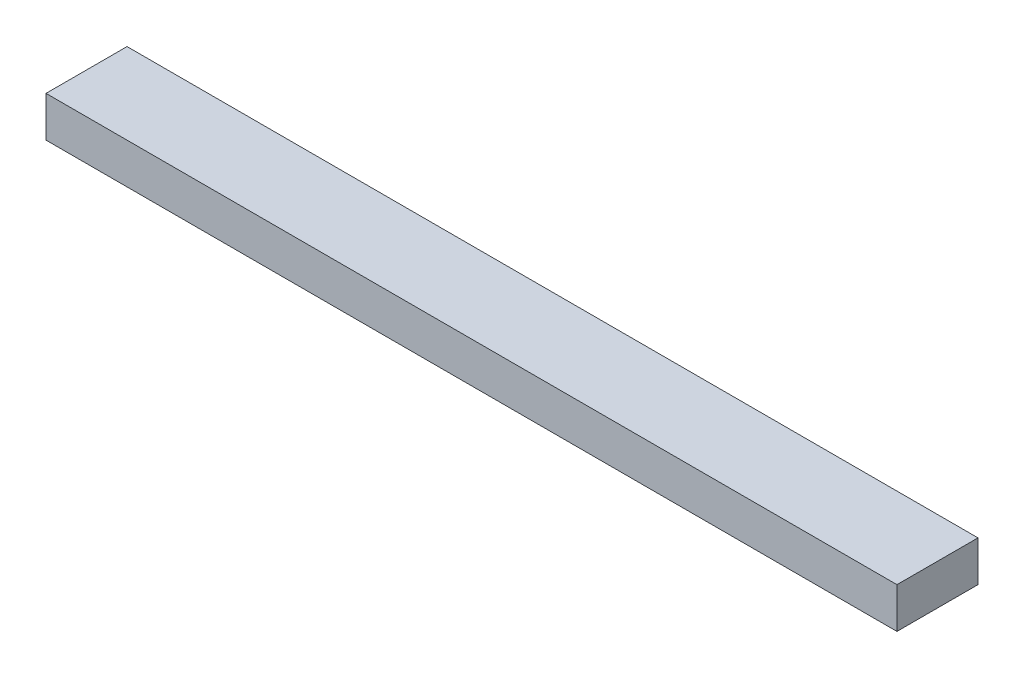
ISO-10303-21;
HEADER;
FILE_DESCRIPTION(('STEP AP214'),'2;1');
FILE_NAME('part.step','',(''),(''),'','','');
FILE_SCHEMA(('AUTOMOTIVE_DESIGN { 1 0 10303 214 1 1 1 1 }'));
ENDSEC;
DATA;
#1=APPLICATION_CONTEXT('core data for automotive mechanical design processes');
#2=APPLICATION_PROTOCOL_DEFINITION('international standard','automotive_design',2000,#1);
#3=PRODUCT_CONTEXT('',#1,'mechanical');
#4=PRODUCT('Part','Part','',(#3));
#5=PRODUCT_RELATED_PRODUCT_CATEGORY('part','',(#4));
#6=PRODUCT_DEFINITION_FORMATION('','',#4);
#7=PRODUCT_DEFINITION_CONTEXT('part definition',#1,'design');
#8=PRODUCT_DEFINITION('design','',#6,#7);
#9=PRODUCT_DEFINITION_SHAPE('','',#8);
#10=(LENGTH_UNIT() NAMED_UNIT(*) SI_UNIT(.MILLI.,.METRE.));
#11=(NAMED_UNIT(*) PLANE_ANGLE_UNIT() SI_UNIT($,.RADIAN.));
#12=(NAMED_UNIT(*) SI_UNIT($,.STERADIAN.) SOLID_ANGLE_UNIT());
#13=UNCERTAINTY_MEASURE_WITH_UNIT(LENGTH_MEASURE(1.E-05),#10,'distance_accuracy_value','');
#14=(GEOMETRIC_REPRESENTATION_CONTEXT(3) GLOBAL_UNCERTAINTY_ASSIGNED_CONTEXT((#13)) GLOBAL_UNIT_ASSIGNED_CONTEXT((#10,
#11,#12)) REPRESENTATION_CONTEXT('',''));
#15=CARTESIAN_POINT('',(0.,0.,0.));
#16=DIRECTION('',(0.,0.,1.));
#17=DIRECTION('',(1.,0.,0.));
#18=AXIS2_PLACEMENT_3D('',#15,#16,#17);
#19=CARTESIAN_POINT('',(266.7,50.8,-190.5));
#20=DIRECTION('',(0.,0.,-1.));
#21=DIRECTION('',(0.,1.,0.));
#22=AXIS2_PLACEMENT_3D('',#19,#20,#21);
#23=PLANE('',#22);
#24=DIRECTION('',(-1.,0.,0.));
#25=VECTOR('',#24,1.);
#26=CARTESIAN_POINT('',(266.7,50.8,-190.5));
#27=LINE('',#26,#25);
#28=CARTESIAN_POINT('',(266.7,50.8,-190.5));
#29=VERTEX_POINT('',#28);
#30=CARTESIAN_POINT('',(-266.7,50.8,-190.5));
#31=VERTEX_POINT('',#30);
#32=EDGE_CURVE('E94',#29,#31,#27,.T.);
#33=ORIENTED_EDGE('',*,*,#32,.T.);
#34=DIRECTION('',(0.,-1.,0.));
#35=VECTOR('',#34,1.);
#36=CARTESIAN_POINT('',(-266.7,50.8,-190.5));
#37=LINE('',#36,#35);
#38=CARTESIAN_POINT('',(-266.7,25.4,-190.5));
#39=VERTEX_POINT('',#38);
#40=EDGE_CURVE('E89',#31,#39,#37,.T.);
#41=ORIENTED_EDGE('',*,*,#40,.T.);
#42=DIRECTION('',(-1.,0.,0.));
#43=VECTOR('',#42,1.);
#44=CARTESIAN_POINT('',(266.7,25.4,-190.5));
#45=LINE('',#44,#43);
#46=CARTESIAN_POINT('',(266.7,25.4,-190.5));
#47=VERTEX_POINT('',#46);
#48=EDGE_CURVE('E11',#47,#39,#45,.T.);
#49=ORIENTED_EDGE('',*,*,#48,.F.);
#50=DIRECTION('',(0.,-1.,0.));
#51=VECTOR('',#50,1.);
#52=CARTESIAN_POINT('',(266.7,50.8,-190.5));
#53=LINE('',#52,#51);
#54=EDGE_CURVE('E100',#29,#47,#53,.T.);
#55=ORIENTED_EDGE('',*,*,#54,.F.);
#56=EDGE_LOOP('',(#33,#41,#49,#55));
#57=FACE_BOUND('',#56,.T.);
#58=ADVANCED_FACE('F37',(#57),#23,.F.);
#59=CARTESIAN_POINT('',(266.7,25.4,-190.5));
#60=DIRECTION('',(0.,1.,0.));
#61=DIRECTION('',(0.,0.,1.));
#62=AXIS2_PLACEMENT_3D('',#59,#60,#61);
#63=PLANE('',#62);
#64=ORIENTED_EDGE('',*,*,#48,.T.);
#65=DIRECTION('',(0.,0.,-1.));
#66=VECTOR('',#65,1.);
#67=CARTESIAN_POINT('',(-266.7,25.4,-190.5));
#68=LINE('',#67,#66);
#69=CARTESIAN_POINT('',(-266.7,25.4,-241.3));
#70=VERTEX_POINT('',#69);
#71=EDGE_CURVE('E79',#39,#70,#68,.T.);
#72=ORIENTED_EDGE('',*,*,#71,.T.);
#73=DIRECTION('',(-1.,0.,0.));
#74=VECTOR('',#73,1.);
#75=CARTESIAN_POINT('',(266.7,25.4,-241.3));
#76=LINE('',#75,#74);
#77=CARTESIAN_POINT('',(266.7,25.4,-241.3));
#78=VERTEX_POINT('',#77);
#79=EDGE_CURVE('E44',#78,#70,#76,.T.);
#80=ORIENTED_EDGE('',*,*,#79,.F.);
#81=DIRECTION('',(0.,0.,-1.));
#82=VECTOR('',#81,1.);
#83=CARTESIAN_POINT('',(266.7,25.4,-190.5));
#84=LINE('',#83,#82);
#85=EDGE_CURVE('E80',#47,#78,#84,.T.);
#86=ORIENTED_EDGE('',*,*,#85,.F.);
#87=EDGE_LOOP('',(#64,#72,#80,#86));
#88=FACE_BOUND('',#87,.T.);
#89=ADVANCED_FACE('F77',(#88),#63,.F.);
#90=CARTESIAN_POINT('',(266.7,50.8,-241.3));
#91=DIRECTION('',(0.,0.,1.));
#92=DIRECTION('',(0.,-1.,0.));
#93=AXIS2_PLACEMENT_3D('',#90,#91,#92);
#94=PLANE('',#93);
#95=ORIENTED_EDGE('',*,*,#79,.T.);
#96=DIRECTION('',(0.,1.,0.));
#97=VECTOR('',#96,1.);
#98=CARTESIAN_POINT('',(-266.7,50.8,-241.3));
#99=LINE('',#98,#97);
#100=CARTESIAN_POINT('',(-266.7,50.8,-241.3));
#101=VERTEX_POINT('',#100);
#102=EDGE_CURVE('E92',#70,#101,#99,.T.);
#103=ORIENTED_EDGE('',*,*,#102,.T.);
#104=DIRECTION('',(-1.,0.,0.));
#105=VECTOR('',#104,1.);
#106=CARTESIAN_POINT('',(266.7,50.8,-241.3));
#107=LINE('',#106,#105);
#108=CARTESIAN_POINT('',(266.7,50.8,-241.3));
#109=VERTEX_POINT('',#108);
#110=EDGE_CURVE('E106',#109,#101,#107,.T.);
#111=ORIENTED_EDGE('',*,*,#110,.F.);
#112=DIRECTION('',(0.,1.,0.));
#113=VECTOR('',#112,1.);
#114=CARTESIAN_POINT('',(266.7,50.8,-241.3));
#115=LINE('',#114,#113);
#116=EDGE_CURVE('E56',#78,#109,#115,.T.);
#117=ORIENTED_EDGE('',*,*,#116,.F.);
#118=EDGE_LOOP('',(#95,#103,#111,#117));
#119=FACE_BOUND('',#118,.T.);
#120=ADVANCED_FACE('F108',(#119),#94,.F.);
#121=CARTESIAN_POINT('',(266.7,50.8,-241.3));
#122=DIRECTION('',(0.,-1.,0.));
#123=DIRECTION('',(0.,0.,-1.));
#124=AXIS2_PLACEMENT_3D('',#121,#122,#123);
#125=PLANE('',#124);
#126=ORIENTED_EDGE('',*,*,#110,.T.);
#127=DIRECTION('',(0.,0.,1.));
#128=VECTOR('',#127,1.);
#129=CARTESIAN_POINT('',(-266.7,50.8,-241.3));
#130=LINE('',#129,#128);
#131=EDGE_CURVE('E98',#101,#31,#130,.T.);
#132=ORIENTED_EDGE('',*,*,#131,.T.);
#133=ORIENTED_EDGE('',*,*,#32,.F.);
#134=DIRECTION('',(0.,0.,1.));
#135=VECTOR('',#134,1.);
#136=CARTESIAN_POINT('',(266.7,50.8,-241.3));
#137=LINE('',#136,#135);
#138=EDGE_CURVE('E51',#109,#29,#137,.T.);
#139=ORIENTED_EDGE('',*,*,#138,.F.);
#140=EDGE_LOOP('',(#126,#132,#133,#139));
#141=FACE_BOUND('',#140,.T.);
#142=ADVANCED_FACE('F110',(#141),#125,.F.);
#143=CARTESIAN_POINT('',(266.7,0.,0.));
#144=DIRECTION('',(1.,0.,0.));
#145=DIRECTION('',(0.,0.,-1.));
#146=AXIS2_PLACEMENT_3D('',#143,#144,#145);
#147=PLANE('',#146);
#148=ORIENTED_EDGE('',*,*,#54,.T.);
#149=ORIENTED_EDGE('',*,*,#85,.T.);
#150=ORIENTED_EDGE('',*,*,#116,.T.);
#151=ORIENTED_EDGE('',*,*,#138,.T.);
#152=EDGE_LOOP('',(#148,#149,#150,#151));
#153=FACE_BOUND('',#152,.T.);
#154=ADVANCED_FACE('F111',(#153),#147,.T.);
#155=CARTESIAN_POINT('',(-266.7,0.,0.));
#156=DIRECTION('',(1.,0.,0.));
#157=DIRECTION('',(0.,0.,-1.));
#158=AXIS2_PLACEMENT_3D('',#155,#156,#157);
#159=PLANE('',#158);
#160=ORIENTED_EDGE('',*,*,#40,.F.);
#161=ORIENTED_EDGE('',*,*,#131,.F.);
#162=ORIENTED_EDGE('',*,*,#102,.F.);
#163=ORIENTED_EDGE('',*,*,#71,.F.);
#164=EDGE_LOOP('',(#160,#161,#162,#163));
#165=FACE_BOUND('',#164,.T.);
#166=ADVANCED_FACE('F87',(#165),#159,.F.);
#167=CLOSED_SHELL('',(#58,#89,#120,#142,#154,#166));
#168=MANIFOLD_SOLID_BREP('B2',#167);
#169=ADVANCED_BREP_SHAPE_REPRESENTATION('',(#18,#168),#14);
#170=SHAPE_DEFINITION_REPRESENTATION(#9,#169);
ENDSEC;
END-ISO-10303-21;
